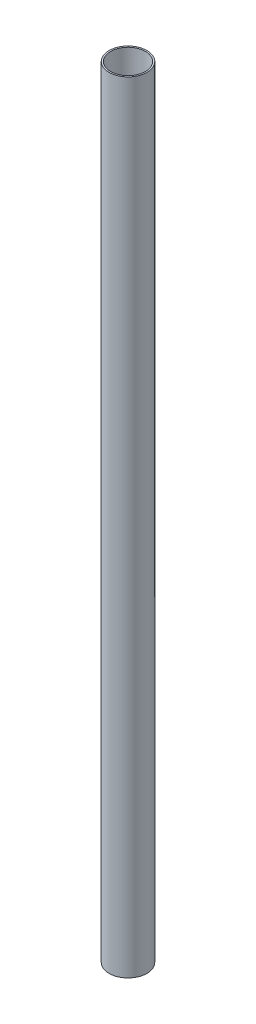
ISO-10303-21;
HEADER;
FILE_DESCRIPTION(('STEP AP214'),'2;1');
FILE_NAME('part.step','',(''),(''),'','','');
FILE_SCHEMA(('AUTOMOTIVE_DESIGN { 1 0 10303 214 1 1 1 1 }'));
ENDSEC;
DATA;
#1=APPLICATION_CONTEXT('core data for automotive mechanical design processes');
#2=APPLICATION_PROTOCOL_DEFINITION('international standard','automotive_design',2000,#1);
#3=PRODUCT_CONTEXT('',#1,'mechanical');
#4=PRODUCT('Part','Part','',(#3));
#5=PRODUCT_RELATED_PRODUCT_CATEGORY('part','',(#4));
#6=PRODUCT_DEFINITION_FORMATION('','',#4);
#7=PRODUCT_DEFINITION_CONTEXT('part definition',#1,'design');
#8=PRODUCT_DEFINITION('design','',#6,#7);
#9=PRODUCT_DEFINITION_SHAPE('','',#8);
#10=(LENGTH_UNIT() NAMED_UNIT(*) SI_UNIT(.MILLI.,.METRE.));
#11=(NAMED_UNIT(*) PLANE_ANGLE_UNIT() SI_UNIT($,.RADIAN.));
#12=(NAMED_UNIT(*) SI_UNIT($,.STERADIAN.) SOLID_ANGLE_UNIT());
#13=UNCERTAINTY_MEASURE_WITH_UNIT(LENGTH_MEASURE(1.E-05),#10,'distance_accuracy_value','');
#14=(GEOMETRIC_REPRESENTATION_CONTEXT(3) GLOBAL_UNCERTAINTY_ASSIGNED_CONTEXT((#13)) GLOBAL_UNIT_ASSIGNED_CONTEXT((#10,
#11,#12)) REPRESENTATION_CONTEXT('',''));
#15=CARTESIAN_POINT('',(0.,0.,0.));
#16=DIRECTION('',(0.,0.,1.));
#17=DIRECTION('',(1.,0.,0.));
#18=AXIS2_PLACEMENT_3D('',#15,#16,#17);
#19=CARTESIAN_POINT('',(420.000000000003,110.,0.));
#20=DIRECTION('',(0.,-1.,0.));
#21=DIRECTION('',(0.,0.,-1.));
#22=AXIS2_PLACEMENT_3D('',#19,#20,#21);
#23=PLANE('',#22);
#24=CARTESIAN_POINT('',(420.000000000003,110.,0.));
#25=DIRECTION('',(0.,-1.,0.));
#26=DIRECTION('',(0.,0.,-1.));
#27=AXIS2_PLACEMENT_3D('',#24,#25,#26);
#28=CIRCLE('',#27,12.5);
#29=CARTESIAN_POINT('',(420.000000000003,110.,-12.5));
#30=VERTEX_POINT('',#29);
#31=EDGE_CURVE('E10',#30,#30,#28,.T.);
#32=ORIENTED_EDGE('',*,*,#31,.T.);
#33=EDGE_LOOP('',(#32));
#34=FACE_BOUND('',#33,.T.);
#35=CARTESIAN_POINT('',(420.000000000003,110.,0.));
#36=DIRECTION('',(0.,-1.,0.));
#37=DIRECTION('',(0.,0.,-1.));
#38=AXIS2_PLACEMENT_3D('',#35,#36,#37);
#39=CIRCLE('',#38,11.5);
#40=CARTESIAN_POINT('',(420.000000000003,110.,-11.5));
#41=VERTEX_POINT('',#40);
#42=EDGE_CURVE('E41',#41,#41,#39,.T.);
#43=ORIENTED_EDGE('',*,*,#42,.F.);
#44=EDGE_LOOP('',(#43));
#45=FACE_BOUND('',#44,.T.);
#46=ADVANCED_FACE('F30',(#34,#45),#23,.T.);
#47=CARTESIAN_POINT('',(420.000000000003,625.,0.));
#48=DIRECTION('',(0.,-1.,0.));
#49=DIRECTION('',(0.,0.,-1.));
#50=AXIS2_PLACEMENT_3D('',#47,#48,#49);
#51=PLANE('',#50);
#52=CARTESIAN_POINT('',(420.000000000003,625.,0.));
#53=DIRECTION('',(0.,-1.,0.));
#54=DIRECTION('',(0.,0.,-1.));
#55=AXIS2_PLACEMENT_3D('',#52,#53,#54);
#56=CIRCLE('',#55,12.5);
#57=CARTESIAN_POINT('',(420.000000000003,625.,-12.5));
#58=VERTEX_POINT('',#57);
#59=EDGE_CURVE('E34',#58,#58,#56,.T.);
#60=ORIENTED_EDGE('',*,*,#59,.F.);
#61=EDGE_LOOP('',(#60));
#62=FACE_BOUND('',#61,.T.);
#63=CARTESIAN_POINT('',(420.000000000003,625.,0.));
#64=DIRECTION('',(0.,-1.,0.));
#65=DIRECTION('',(0.,0.,-1.));
#66=AXIS2_PLACEMENT_3D('',#63,#64,#65);
#67=CIRCLE('',#66,11.5);
#68=CARTESIAN_POINT('',(420.000000000003,625.,-11.5));
#69=VERTEX_POINT('',#68);
#70=EDGE_CURVE('E43',#69,#69,#67,.T.);
#71=ORIENTED_EDGE('',*,*,#70,.T.);
#72=EDGE_LOOP('',(#71));
#73=FACE_BOUND('',#72,.T.);
#74=ADVANCED_FACE('F53',(#62,#73),#51,.F.);
#75=CARTESIAN_POINT('',(420.000000000003,110.,0.));
#76=DIRECTION('',(0.,1.,0.));
#77=DIRECTION('',(0.,0.,1.));
#78=AXIS2_PLACEMENT_3D('',#75,#76,#77);
#79=CYLINDRICAL_SURFACE('',#78,12.5);
#80=ORIENTED_EDGE('',*,*,#31,.F.);
#81=EDGE_LOOP('',(#80));
#82=FACE_BOUND('',#81,.T.);
#83=ORIENTED_EDGE('',*,*,#59,.T.);
#84=EDGE_LOOP('',(#83));
#85=FACE_BOUND('',#84,.T.);
#86=ADVANCED_FACE('F32',(#82,#85),#79,.T.);
#87=CARTESIAN_POINT('',(420.000000000003,110.,0.));
#88=DIRECTION('',(0.,1.,0.));
#89=DIRECTION('',(0.,0.,1.));
#90=AXIS2_PLACEMENT_3D('',#87,#88,#89);
#91=CYLINDRICAL_SURFACE('',#90,11.5);
#92=ORIENTED_EDGE('',*,*,#42,.T.);
#93=EDGE_LOOP('',(#92));
#94=FACE_BOUND('',#93,.T.);
#95=ORIENTED_EDGE('',*,*,#70,.F.);
#96=EDGE_LOOP('',(#95));
#97=FACE_BOUND('',#96,.T.);
#98=ADVANCED_FACE('F49',(#94,#97),#91,.F.);
#99=CLOSED_SHELL('',(#46,#74,#86,#98));
#100=MANIFOLD_SOLID_BREP('B2',#99);
#101=ADVANCED_BREP_SHAPE_REPRESENTATION('',(#18,#100),#14);
#102=SHAPE_DEFINITION_REPRESENTATION(#9,#101);
ENDSEC;
END-ISO-10303-21;
